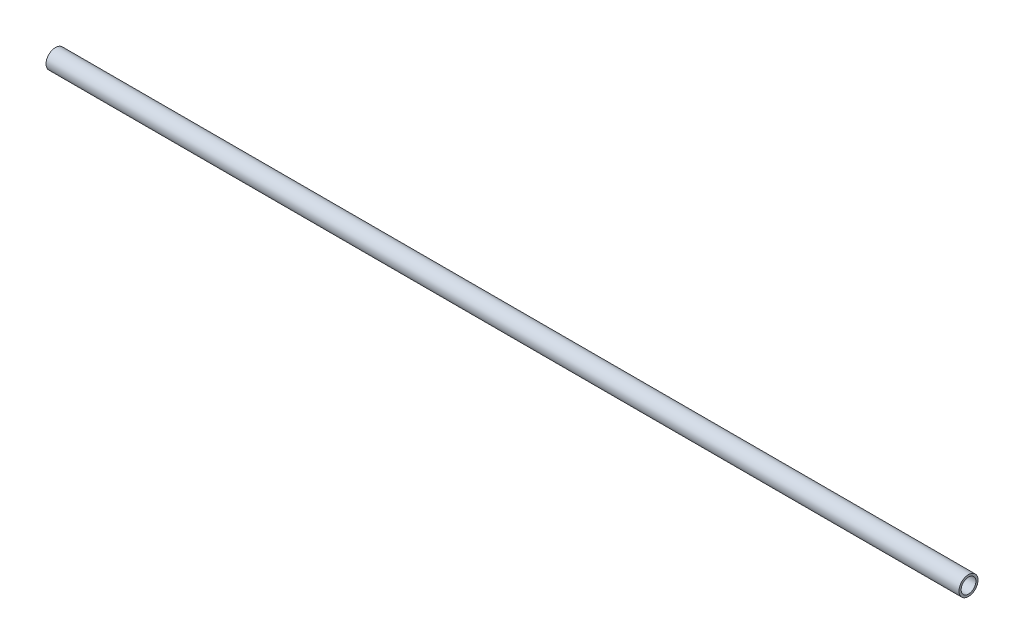
ISO-10303-21;
HEADER;
FILE_DESCRIPTION(('STEP AP214'),'2;1');
FILE_NAME('part.step','',(''),(''),'','','');
FILE_SCHEMA(('AUTOMOTIVE_DESIGN { 1 0 10303 214 1 1 1 1 }'));
ENDSEC;
DATA;
#1=APPLICATION_CONTEXT('core data for automotive mechanical design processes');
#2=APPLICATION_PROTOCOL_DEFINITION('international standard','automotive_design',2000,#1);
#3=PRODUCT_CONTEXT('',#1,'mechanical');
#4=PRODUCT('Part','Part','',(#3));
#5=PRODUCT_RELATED_PRODUCT_CATEGORY('part','',(#4));
#6=PRODUCT_DEFINITION_FORMATION('','',#4);
#7=PRODUCT_DEFINITION_CONTEXT('part definition',#1,'design');
#8=PRODUCT_DEFINITION('design','',#6,#7);
#9=PRODUCT_DEFINITION_SHAPE('','',#8);
#10=(LENGTH_UNIT() NAMED_UNIT(*) SI_UNIT(.MILLI.,.METRE.));
#11=(NAMED_UNIT(*) PLANE_ANGLE_UNIT() SI_UNIT($,.RADIAN.));
#12=(NAMED_UNIT(*) SI_UNIT($,.STERADIAN.) SOLID_ANGLE_UNIT());
#13=UNCERTAINTY_MEASURE_WITH_UNIT(LENGTH_MEASURE(1.E-05),#10,'distance_accuracy_value','');
#14=(GEOMETRIC_REPRESENTATION_CONTEXT(3) GLOBAL_UNCERTAINTY_ASSIGNED_CONTEXT((#13)) GLOBAL_UNIT_ASSIGNED_CONTEXT((#10,
#11,#12)) REPRESENTATION_CONTEXT('',''));
#15=CARTESIAN_POINT('',(0.,0.,0.));
#16=DIRECTION('',(0.,0.,1.));
#17=DIRECTION('',(1.,0.,0.));
#18=AXIS2_PLACEMENT_3D('',#15,#16,#17);
#19=CARTESIAN_POINT('',(152.4,0.,0.));
#20=DIRECTION('',(1.,0.,0.));
#21=DIRECTION('',(0.,0.,-1.));
#22=AXIS2_PLACEMENT_3D('',#19,#20,#21);
#23=PLANE('',#22);
#24=CARTESIAN_POINT('',(152.4,0.,0.));
#25=DIRECTION('',(1.,0.,0.));
#26=DIRECTION('',(0.,0.,-1.));
#27=AXIS2_PLACEMENT_3D('',#24,#25,#26);
#28=CIRCLE('',#27,3.175);
#29=CARTESIAN_POINT('',(152.4,0.,3.175));
#30=VERTEX_POINT('',#29);
#31=EDGE_CURVE('E10',#30,#30,#28,.T.);
#32=ORIENTED_EDGE('',*,*,#31,.T.);
#33=EDGE_LOOP('',(#32));
#34=FACE_BOUND('',#33,.T.);
#35=CARTESIAN_POINT('',(152.4,0.,0.));
#36=DIRECTION('',(1.,0.,0.));
#37=DIRECTION('',(0.,0.,-1.));
#38=AXIS2_PLACEMENT_3D('',#35,#36,#37);
#39=CIRCLE('',#38,2.4638);
#40=CARTESIAN_POINT('',(152.4,0.,2.4638));
#41=VERTEX_POINT('',#40);
#42=EDGE_CURVE('E41',#41,#41,#39,.T.);
#43=ORIENTED_EDGE('',*,*,#42,.F.);
#44=EDGE_LOOP('',(#43));
#45=FACE_BOUND('',#44,.T.);
#46=ADVANCED_FACE('F30',(#34,#45),#23,.T.);
#47=CARTESIAN_POINT('',(-152.4,0.,0.));
#48=DIRECTION('',(1.,0.,0.));
#49=DIRECTION('',(0.,0.,-1.));
#50=AXIS2_PLACEMENT_3D('',#47,#48,#49);
#51=PLANE('',#50);
#52=CARTESIAN_POINT('',(-152.4,0.,0.));
#53=DIRECTION('',(1.,0.,0.));
#54=DIRECTION('',(0.,0.,-1.));
#55=AXIS2_PLACEMENT_3D('',#52,#53,#54);
#56=CIRCLE('',#55,3.175);
#57=CARTESIAN_POINT('',(-152.4,0.,3.175));
#58=VERTEX_POINT('',#57);
#59=EDGE_CURVE('E34',#58,#58,#56,.T.);
#60=ORIENTED_EDGE('',*,*,#59,.F.);
#61=EDGE_LOOP('',(#60));
#62=FACE_BOUND('',#61,.T.);
#63=CARTESIAN_POINT('',(-152.4,0.,0.));
#64=DIRECTION('',(1.,0.,0.));
#65=DIRECTION('',(0.,0.,-1.));
#66=AXIS2_PLACEMENT_3D('',#63,#64,#65);
#67=CIRCLE('',#66,2.4638);
#68=CARTESIAN_POINT('',(-152.4,0.,2.4638));
#69=VERTEX_POINT('',#68);
#70=EDGE_CURVE('E43',#69,#69,#67,.T.);
#71=ORIENTED_EDGE('',*,*,#70,.T.);
#72=EDGE_LOOP('',(#71));
#73=FACE_BOUND('',#72,.T.);
#74=ADVANCED_FACE('F53',(#62,#73),#51,.F.);
#75=CARTESIAN_POINT('',(152.4,0.,0.));
#76=DIRECTION('',(-1.,0.,0.));
#77=DIRECTION('',(0.,0.,1.));
#78=AXIS2_PLACEMENT_3D('',#75,#76,#77);
#79=CYLINDRICAL_SURFACE('',#78,3.175);
#80=CARTESIAN_POINT('',(152.4,0.,3.175));
#81=CARTESIAN_POINT('',(149.225,0.,3.175));
#82=CARTESIAN_POINT('',(146.05,0.,3.175));
#83=CARTESIAN_POINT('',(139.7,0.,3.175));
#84=CARTESIAN_POINT('',(136.525,0.,3.175));
#85=CARTESIAN_POINT('',(130.175,0.,3.175));
#86=CARTESIAN_POINT('',(127.,0.,3.175));
#87=CARTESIAN_POINT('',(120.65,0.,3.175));
#88=CARTESIAN_POINT('',(117.475,0.,3.175));
#89=CARTESIAN_POINT('',(111.125,0.,3.175));
#90=CARTESIAN_POINT('',(107.95,0.,3.175));
#91=CARTESIAN_POINT('',(101.6,0.,3.175));
#92=CARTESIAN_POINT('',(98.425,0.,3.175));
#93=CARTESIAN_POINT('',(92.075,0.,3.175));
#94=CARTESIAN_POINT('',(88.9,0.,3.175));
#95=CARTESIAN_POINT('',(82.55,0.,3.175));
#96=CARTESIAN_POINT('',(79.375,0.,3.175));
#97=CARTESIAN_POINT('',(73.025,0.,3.175));
#98=CARTESIAN_POINT('',(69.85,0.,3.175));
#99=CARTESIAN_POINT('',(63.5,0.,3.175));
#100=CARTESIAN_POINT('',(60.325,0.,3.175));
#101=CARTESIAN_POINT('',(53.975,0.,3.175));
#102=CARTESIAN_POINT('',(50.8,0.,3.175));
#103=CARTESIAN_POINT('',(44.45,0.,3.175));
#104=CARTESIAN_POINT('',(41.275,0.,3.175));
#105=CARTESIAN_POINT('',(34.925,0.,3.175));
#106=CARTESIAN_POINT('',(31.75,0.,3.175));
#107=CARTESIAN_POINT('',(25.4,0.,3.175));
#108=CARTESIAN_POINT('',(22.225,0.,3.175));
#109=CARTESIAN_POINT('',(15.875,0.,3.175));
#110=CARTESIAN_POINT('',(12.7,0.,3.175));
#111=CARTESIAN_POINT('',(6.34999999999998,0.,3.175));
#112=CARTESIAN_POINT('',(3.17499999999997,0.,3.175));
#113=CARTESIAN_POINT('',(-3.17500000000003,0.,3.175));
#114=CARTESIAN_POINT('',(-6.35000000000003,0.,3.175));
#115=CARTESIAN_POINT('',(-12.7,0.,3.175));
#116=CARTESIAN_POINT('',(-15.875,0.,3.175));
#117=CARTESIAN_POINT('',(-22.225,0.,3.175));
#118=CARTESIAN_POINT('',(-25.4,0.,3.175));
#119=CARTESIAN_POINT('',(-31.75,0.,3.175));
#120=CARTESIAN_POINT('',(-34.925,0.,3.175));
#121=CARTESIAN_POINT('',(-41.275,0.,3.175));
#122=CARTESIAN_POINT('',(-44.45,0.,3.175));
#123=CARTESIAN_POINT('',(-50.8,0.,3.175));
#124=CARTESIAN_POINT('',(-53.975,0.,3.175));
#125=CARTESIAN_POINT('',(-60.325,0.,3.175));
#126=CARTESIAN_POINT('',(-63.5,0.,3.175));
#127=CARTESIAN_POINT('',(-69.85,0.,3.175));
#128=CARTESIAN_POINT('',(-73.025,0.,3.175));
#129=CARTESIAN_POINT('',(-79.375,0.,3.175));
#130=CARTESIAN_POINT('',(-82.5500000000001,0.,3.175));
#131=CARTESIAN_POINT('',(-88.9,0.,3.175));
#132=CARTESIAN_POINT('',(-92.0750000000001,0.,3.175));
#133=CARTESIAN_POINT('',(-98.425,0.,3.175));
#134=CARTESIAN_POINT('',(-101.6,0.,3.175));
#135=CARTESIAN_POINT('',(-107.95,0.,3.175));
#136=CARTESIAN_POINT('',(-111.125,0.,3.175));
#137=CARTESIAN_POINT('',(-117.475,0.,3.175));
#138=CARTESIAN_POINT('',(-120.65,0.,3.175));
#139=CARTESIAN_POINT('',(-127.,0.,3.175));
#140=CARTESIAN_POINT('',(-130.175,0.,3.175));
#141=CARTESIAN_POINT('',(-136.525,0.,3.175));
#142=CARTESIAN_POINT('',(-139.7,0.,3.175));
#143=CARTESIAN_POINT('',(-146.05,0.,3.175));
#144=CARTESIAN_POINT('',(-149.225,0.,3.175));
#145=CARTESIAN_POINT('',(-152.4,0.,3.175));
#146=B_SPLINE_CURVE_WITH_KNOTS('',3,(#80,#81,#82,#83,#84,#85,#86,#87,#88,#89,#90,#91,#92,#93,
#94,#95,#96,#97,#98,#99,#100,#101,#102,#103,#104,#105,#106,#107,#108,#109,#110,#111,#112,#113,
#114,#115,#116,#117,#118,#119,#120,#121,#122,#123,#124,#125,#126,#127,#128,#129,#130,#131,#132,
#133,#134,#135,#136,#137,#138,#139,#140,#141,#142,#143,#144,#145),.UNSPECIFIED.,.F.,.F.,(4,2,2,
2,2,2,2,2,2,2,2,2,2,2,2,2,2,2,2,2,2,2,2,2,2,2,2,2,2,2,2,2,4),(0.,9.52499999999998,19.05,28.575,
38.1,47.625,57.15,66.675,76.2,85.725,95.25,104.775,114.3,123.825,133.35,142.875,152.4,161.925,
171.45,180.975,190.5,200.025,209.55,219.075,228.6,238.125,247.65,257.175,266.7,276.225,285.75,
295.275,304.8),.UNSPECIFIED.);
#147=EDGE_CURVE('BSEAM32',#30,#58,#146,.T.);
#148=ORIENTED_EDGE('',*,*,#31,.F.);
#149=ORIENTED_EDGE('',*,*,#59,.T.);
#150=ORIENTED_EDGE('',*,*,#147,.T.);
#151=ORIENTED_EDGE('',*,*,#147,.F.);
#152=EDGE_LOOP('',(#148,#150,#149,#151));
#153=FACE_BOUND('',#152,.T.);
#154=ADVANCED_FACE('F32',(#153),#79,.T.);
#155=CARTESIAN_POINT('',(152.4,0.,0.));
#156=DIRECTION('',(-1.,0.,0.));
#157=DIRECTION('',(0.,0.,1.));
#158=AXIS2_PLACEMENT_3D('',#155,#156,#157);
#159=CYLINDRICAL_SURFACE('',#158,2.4638);
#160=CARTESIAN_POINT('',(152.4,0.,2.4638));
#161=CARTESIAN_POINT('',(149.225,0.,2.4638));
#162=CARTESIAN_POINT('',(146.05,0.,2.4638));
#163=CARTESIAN_POINT('',(139.7,0.,2.4638));
#164=CARTESIAN_POINT('',(136.525,0.,2.4638));
#165=CARTESIAN_POINT('',(130.175,0.,2.4638));
#166=CARTESIAN_POINT('',(127.,0.,2.4638));
#167=CARTESIAN_POINT('',(120.65,0.,2.4638));
#168=CARTESIAN_POINT('',(117.475,0.,2.4638));
#169=CARTESIAN_POINT('',(111.125,0.,2.4638));
#170=CARTESIAN_POINT('',(107.95,0.,2.4638));
#171=CARTESIAN_POINT('',(101.6,0.,2.4638));
#172=CARTESIAN_POINT('',(98.425,0.,2.4638));
#173=CARTESIAN_POINT('',(92.075,0.,2.4638));
#174=CARTESIAN_POINT('',(88.9,0.,2.4638));
#175=CARTESIAN_POINT('',(82.55,0.,2.4638));
#176=CARTESIAN_POINT('',(79.375,0.,2.4638));
#177=CARTESIAN_POINT('',(73.025,0.,2.4638));
#178=CARTESIAN_POINT('',(69.85,0.,2.4638));
#179=CARTESIAN_POINT('',(63.5,0.,2.4638));
#180=CARTESIAN_POINT('',(60.325,0.,2.4638));
#181=CARTESIAN_POINT('',(53.975,0.,2.4638));
#182=CARTESIAN_POINT('',(50.8,0.,2.4638));
#183=CARTESIAN_POINT('',(44.45,0.,2.4638));
#184=CARTESIAN_POINT('',(41.275,0.,2.4638));
#185=CARTESIAN_POINT('',(34.925,0.,2.4638));
#186=CARTESIAN_POINT('',(31.75,0.,2.4638));
#187=CARTESIAN_POINT('',(25.4,0.,2.4638));
#188=CARTESIAN_POINT('',(22.225,0.,2.4638));
#189=CARTESIAN_POINT('',(15.875,0.,2.4638));
#190=CARTESIAN_POINT('',(12.7,0.,2.4638));
#191=CARTESIAN_POINT('',(6.34999999999998,0.,2.4638));
#192=CARTESIAN_POINT('',(3.17499999999997,0.,2.4638));
#193=CARTESIAN_POINT('',(-3.17500000000003,0.,2.4638));
#194=CARTESIAN_POINT('',(-6.35000000000003,0.,2.4638));
#195=CARTESIAN_POINT('',(-12.7,0.,2.4638));
#196=CARTESIAN_POINT('',(-15.875,0.,2.4638));
#197=CARTESIAN_POINT('',(-22.225,0.,2.4638));
#198=CARTESIAN_POINT('',(-25.4,0.,2.4638));
#199=CARTESIAN_POINT('',(-31.75,0.,2.4638));
#200=CARTESIAN_POINT('',(-34.925,0.,2.4638));
#201=CARTESIAN_POINT('',(-41.275,0.,2.4638));
#202=CARTESIAN_POINT('',(-44.45,0.,2.4638));
#203=CARTESIAN_POINT('',(-50.8,0.,2.4638));
#204=CARTESIAN_POINT('',(-53.975,0.,2.4638));
#205=CARTESIAN_POINT('',(-60.325,0.,2.4638));
#206=CARTESIAN_POINT('',(-63.5,0.,2.4638));
#207=CARTESIAN_POINT('',(-69.85,0.,2.4638));
#208=CARTESIAN_POINT('',(-73.025,0.,2.4638));
#209=CARTESIAN_POINT('',(-79.375,0.,2.4638));
#210=CARTESIAN_POINT('',(-82.5500000000001,0.,2.4638));
#211=CARTESIAN_POINT('',(-88.9,0.,2.4638));
#212=CARTESIAN_POINT('',(-92.0750000000001,0.,2.4638));
#213=CARTESIAN_POINT('',(-98.425,0.,2.4638));
#214=CARTESIAN_POINT('',(-101.6,0.,2.4638));
#215=CARTESIAN_POINT('',(-107.95,0.,2.4638));
#216=CARTESIAN_POINT('',(-111.125,0.,2.4638));
#217=CARTESIAN_POINT('',(-117.475,0.,2.4638));
#218=CARTESIAN_POINT('',(-120.65,0.,2.4638));
#219=CARTESIAN_POINT('',(-127.,0.,2.4638));
#220=CARTESIAN_POINT('',(-130.175,0.,2.4638));
#221=CARTESIAN_POINT('',(-136.525,0.,2.4638));
#222=CARTESIAN_POINT('',(-139.7,0.,2.4638));
#223=CARTESIAN_POINT('',(-146.05,0.,2.4638));
#224=CARTESIAN_POINT('',(-149.225,0.,2.4638));
#225=CARTESIAN_POINT('',(-152.4,0.,2.4638));
#226=B_SPLINE_CURVE_WITH_KNOTS('',3,(#160,#161,#162,#163,#164,#165,#166,#167,#168,#169,#170,
#171,#172,#173,#174,#175,#176,#177,#178,#179,#180,#181,#182,#183,#184,#185,#186,#187,#188,#189,
#190,#191,#192,#193,#194,#195,#196,#197,#198,#199,#200,#201,#202,#203,#204,#205,#206,#207,#208,
#209,#210,#211,#212,#213,#214,#215,#216,#217,#218,#219,#220,#221,#222,#223,#224,#225),
.UNSPECIFIED.,.F.,.F.,(4,2,2,2,2,2,2,2,2,2,2,2,2,2,2,2,2,2,2,2,2,2,2,2,2,2,2,2,2,2,2,2,4),(0.,
9.52499999999998,19.05,28.575,38.1,47.625,57.15,66.675,76.2,85.725,95.25,104.775,114.3,123.825,
133.35,142.875,152.4,161.925,171.45,180.975,190.5,200.025,209.55,219.075,228.6,238.125,247.65,
257.175,266.7,276.225,285.75,295.275,304.8),.UNSPECIFIED.);
#227=EDGE_CURVE('BSEAM49',#41,#69,#226,.T.);
#228=ORIENTED_EDGE('',*,*,#42,.T.);
#229=ORIENTED_EDGE('',*,*,#70,.F.);
#230=ORIENTED_EDGE('',*,*,#227,.T.);
#231=ORIENTED_EDGE('',*,*,#227,.F.);
#232=EDGE_LOOP('',(#228,#230,#229,#231));
#233=FACE_BOUND('',#232,.T.);
#234=ADVANCED_FACE('F49',(#233),#159,.F.);
#235=CLOSED_SHELL('',(#46,#74,#154,#234));
#236=MANIFOLD_SOLID_BREP('B2',#235);
#237=ADVANCED_BREP_SHAPE_REPRESENTATION('',(#18,#236),#14);
#238=SHAPE_DEFINITION_REPRESENTATION(#9,#237);
ENDSEC;
END-ISO-10303-21;
